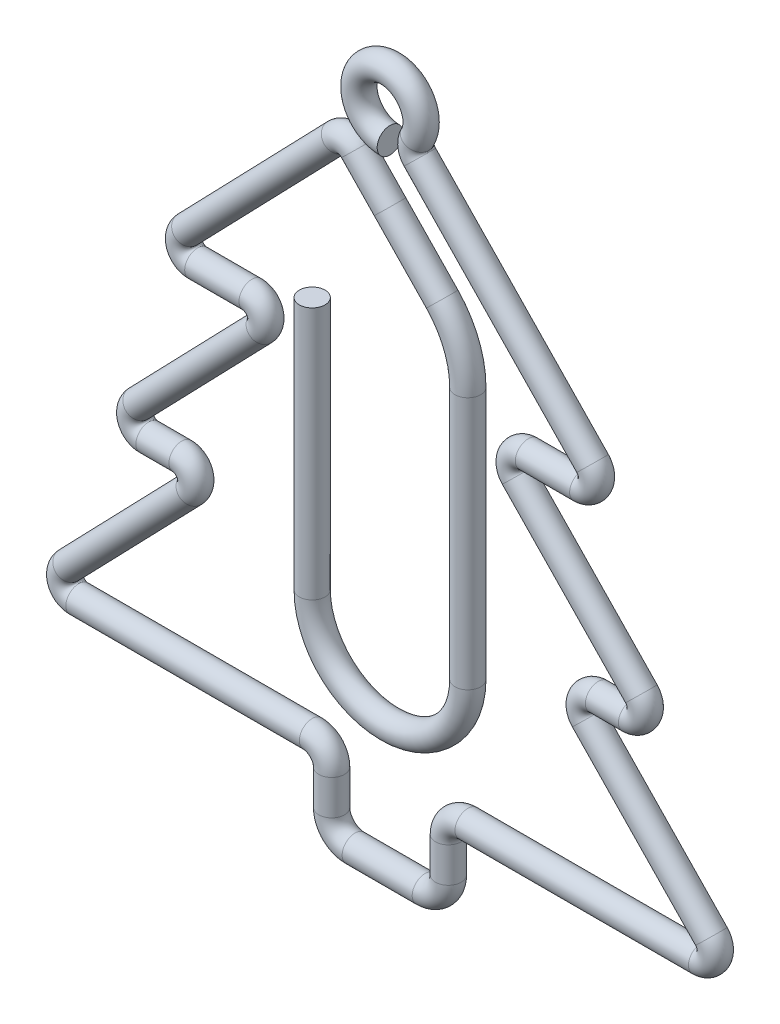
ISO-10303-21;
HEADER;
FILE_DESCRIPTION(('STEP AP214'),'2;1');
FILE_NAME('part.step','',(''),(''),'','','');
FILE_SCHEMA(('AUTOMOTIVE_DESIGN { 1 0 10303 214 1 1 1 1 }'));
ENDSEC;
DATA;
#1=APPLICATION_CONTEXT('core data for automotive mechanical design processes');
#2=APPLICATION_PROTOCOL_DEFINITION('international standard','automotive_design',2000,#1);
#3=PRODUCT_CONTEXT('',#1,'mechanical');
#4=PRODUCT('Part','Part','',(#3));
#5=PRODUCT_RELATED_PRODUCT_CATEGORY('part','',(#4));
#6=PRODUCT_DEFINITION_FORMATION('','',#4);
#7=PRODUCT_DEFINITION_CONTEXT('part definition',#1,'design');
#8=PRODUCT_DEFINITION('design','',#6,#7);
#9=PRODUCT_DEFINITION_SHAPE('','',#8);
#10=(LENGTH_UNIT() NAMED_UNIT(*) SI_UNIT(.MILLI.,.METRE.));
#11=(NAMED_UNIT(*) PLANE_ANGLE_UNIT() SI_UNIT($,.RADIAN.));
#12=(NAMED_UNIT(*) SI_UNIT($,.STERADIAN.) SOLID_ANGLE_UNIT());
#13=UNCERTAINTY_MEASURE_WITH_UNIT(LENGTH_MEASURE(1.E-05),#10,'distance_accuracy_value','');
#14=(GEOMETRIC_REPRESENTATION_CONTEXT(3) GLOBAL_UNCERTAINTY_ASSIGNED_CONTEXT((#13)) GLOBAL_UNIT_ASSIGNED_CONTEXT((#10,
#11,#12)) REPRESENTATION_CONTEXT('',''));
#15=CARTESIAN_POINT('',(0.,0.,0.));
#16=DIRECTION('',(0.,0.,1.));
#17=DIRECTION('',(1.,0.,0.));
#18=AXIS2_PLACEMENT_3D('',#15,#16,#17);
#19=CARTESIAN_POINT('',(0.,-8.,0.));
#20=DIRECTION('',(-1.,0.,0.));
#21=DIRECTION('',(0.,-1.,0.));
#22=AXIS2_PLACEMENT_3D('',#19,#20,#21);
#23=PLANE('',#22);
#24=CARTESIAN_POINT('',(0.,-8.,0.));
#25=DIRECTION('',(-1.,0.,0.));
#26=DIRECTION('',(0.,-1.,0.));
#27=AXIS2_PLACEMENT_3D('',#24,#25,#26);
#28=CIRCLE('',#27,3.3);
#29=CARTESIAN_POINT('',(0.,-11.3,0.));
#30=VERTEX_POINT('',#29);
#31=EDGE_CURVE('E153',#30,#30,#28,.T.);
#32=ORIENTED_EDGE('',*,*,#31,.F.);
#33=EDGE_LOOP('',(#32));
#34=FACE_BOUND('',#33,.T.);
#35=ADVANCED_FACE('F32',(#34),#23,.F.);
#36=CARTESIAN_POINT('',(-20.,-53.,0.));
#37=DIRECTION('',(0.,1.,0.));
#38=DIRECTION('',(-1.,0.,0.));
#39=AXIS2_PLACEMENT_3D('',#36,#37,#38);
#40=PLANE('',#39);
#41=CARTESIAN_POINT('',(-20.,-53.,0.));
#42=DIRECTION('',(0.,1.,0.));
#43=DIRECTION('',(-1.,0.,0.));
#44=AXIS2_PLACEMENT_3D('',#41,#42,#43);
#45=CIRCLE('',#44,3.3);
#46=CARTESIAN_POINT('',(-23.3,-53.,0.));
#47=VERTEX_POINT('',#46);
#48=EDGE_CURVE('E10',#47,#47,#45,.T.);
#49=ORIENTED_EDGE('',*,*,#48,.T.);
#50=EDGE_LOOP('',(#49));
#51=FACE_BOUND('',#50,.T.);
#52=ADVANCED_FACE('F160',(#51),#40,.T.);
#53=CARTESIAN_POINT('',(0.,0.,0.));
#54=DIRECTION('',(0.,0.,-1.));
#55=DIRECTION('',(-1.,0.,0.));
#56=AXIS2_PLACEMENT_3D('',#53,#54,#55);
#57=TOROIDAL_SURFACE('',#56,8.,3.3);
#58=CARTESIAN_POINT('',(7.06881872881562,-3.74590466765313,0.));
#59=DIRECTION('',(-0.468238083456642,-0.883602341101952,0.));
#60=DIRECTION('',(0.883602341101952,-0.468238083456642,0.));
#61=AXIS2_PLACEMENT_3D('',#58,#59,#60);
#62=CIRCLE('',#61,3.3);
#63=CARTESIAN_POINT('',(9.98470645445206,-5.29109034306005,0.));
#64=VERTEX_POINT('',#63);
#65=EDGE_CURVE('E150',#64,#64,#62,.T.);
#66=CARTESIAN_POINT('',(0.,0.,0.));
#67=DIRECTION('',(0.,0.,-1.));
#68=DIRECTION('',(-1.,0.,0.));
#69=AXIS2_PLACEMENT_3D('',#66,#67,#68);
#70=CIRCLE('',#69,11.3);
#71=EDGE_CURVE('',#30,#64,#70,.T.);
#72=ORIENTED_EDGE('',*,*,#31,.T.);
#73=ORIENTED_EDGE('',*,*,#65,.F.);
#74=ORIENTED_EDGE('',*,*,#71,.T.);
#75=ORIENTED_EDGE('',*,*,#71,.F.);
#76=EDGE_LOOP('',(#72,#74,#73,#75));
#77=FACE_BOUND('',#76,.T.);
#78=ADVANCED_FACE('F157',(#77),#57,.T.);
#79=CARTESIAN_POINT('',(10.2497871567827,-5.43156176809704,0.));
#80=DIRECTION('',(0.,0.,1.));
#81=DIRECTION('',(1.,0.,0.));
#82=AXIS2_PLACEMENT_3D('',#79,#80,#81);
#83=TOROIDAL_SURFACE('',#82,3.6,3.3);
#84=CARTESIAN_POINT('',(7.66016387556351,-7.93233190174944,0.));
#85=DIRECTION('',(0.694658370458998,-0.71933980033865,0.));
#86=DIRECTION('',(0.71933980033865,0.694658370458998,0.));
#87=AXIS2_PLACEMENT_3D('',#84,#85,#86);
#88=CIRCLE('',#87,3.3);
#89=CARTESIAN_POINT('',(10.0339852166811,-5.63995927923474,0.));
#90=VERTEX_POINT('',#89);
#91=EDGE_CURVE('E147',#90,#90,#88,.T.);
#92=ORIENTED_EDGE('',*,*,#91,.F.);
#93=EDGE_LOOP('',(#92));
#94=FACE_BOUND('',#93,.T.);
#95=ORIENTED_EDGE('',*,*,#65,.T.);
#96=EDGE_LOOP('',(#95));
#97=FACE_BOUND('',#96,.T.);
#98=ADVANCED_FACE('F310',(#94,#97),#83,.T.);
#99=CARTESIAN_POINT('',(7.66016387556351,-7.93233190174944,0.));
#100=DIRECTION('',(0.694658370458999,-0.71933980033865,0.));
#101=DIRECTION('',(0.71933980033865,0.694658370458999,0.));
#102=AXIS2_PLACEMENT_3D('',#99,#100,#101);
#103=CYLINDRICAL_SURFACE('',#102,3.3);
#104=CARTESIAN_POINT('',(52.0498812526783,-53.8992298663476,0.));
#105=DIRECTION('',(0.694658370458998,-0.71933980033865,0.));
#106=DIRECTION('',(0.71933980033865,0.694658370458998,0.));
#107=AXIS2_PLACEMENT_3D('',#104,#105,#106);
#108=CIRCLE('',#107,3.3);
#109=CARTESIAN_POINT('',(54.4237025937958,-51.6068572438329,0.));
#110=VERTEX_POINT('',#109);
#111=EDGE_CURVE('E144',#110,#110,#108,.T.);
#112=ORIENTED_EDGE('',*,*,#111,.F.);
#113=EDGE_LOOP('',(#112));
#114=FACE_BOUND('',#113,.T.);
#115=ORIENTED_EDGE('',*,*,#91,.T.);
#116=EDGE_LOOP('',(#115));
#117=FACE_BOUND('',#116,.T.);
#118=ADVANCED_FACE('F306',(#114,#117),#103,.T.);
#119=CARTESIAN_POINT('',(49.4602579714592,-56.4,0.));
#120=DIRECTION('',(0.,0.,-1.));
#121=DIRECTION('',(-1.,0.,0.));
#122=AXIS2_PLACEMENT_3D('',#119,#120,#121);
#123=TOROIDAL_SURFACE('',#122,3.6,3.3);
#124=CARTESIAN_POINT('',(49.4602579714592,-60.,0.));
#125=DIRECTION('',(-1.,0.,0.));
#126=DIRECTION('',(0.,-1.,0.));
#127=AXIS2_PLACEMENT_3D('',#124,#125,#126);
#128=CIRCLE('',#127,3.3);
#129=CARTESIAN_POINT('',(49.4602579714592,-63.3,0.));
#130=VERTEX_POINT('',#129);
#131=EDGE_CURVE('E141',#130,#130,#128,.T.);
#132=CARTESIAN_POINT('',(49.4602579714592,-56.4,0.));
#133=DIRECTION('',(0.,0.,-1.));
#134=DIRECTION('',(-1.,0.,0.));
#135=AXIS2_PLACEMENT_3D('',#132,#133,#134);
#136=CIRCLE('',#135,6.9);
#137=EDGE_CURVE('',#110,#130,#136,.T.);
#138=ORIENTED_EDGE('',*,*,#111,.T.);
#139=ORIENTED_EDGE('',*,*,#131,.F.);
#140=ORIENTED_EDGE('',*,*,#137,.T.);
#141=ORIENTED_EDGE('',*,*,#137,.F.);
#142=EDGE_LOOP('',(#138,#140,#139,#141));
#143=FACE_BOUND('',#142,.T.);
#144=ADVANCED_FACE('F302',(#143),#123,.T.);
#145=CARTESIAN_POINT('',(49.4602579714592,-60.,0.));
#146=DIRECTION('',(-1.,0.,0.));
#147=DIRECTION('',(0.,0.,1.));
#148=AXIS2_PLACEMENT_3D('',#145,#146,#147);
#149=CYLINDRICAL_SURFACE('',#148,3.3);
#150=CARTESIAN_POINT('',(35.5061421676126,-60.,0.));
#151=DIRECTION('',(-1.,0.,0.));
#152=DIRECTION('',(0.,-1.,0.));
#153=AXIS2_PLACEMENT_3D('',#150,#151,#152);
#154=CIRCLE('',#153,3.3);
#155=CARTESIAN_POINT('',(35.5061421676126,-56.7,0.));
#156=VERTEX_POINT('',#155);
#157=EDGE_CURVE('E138',#156,#156,#154,.T.);
#158=ORIENTED_EDGE('',*,*,#157,.F.);
#159=EDGE_LOOP('',(#158));
#160=FACE_BOUND('',#159,.T.);
#161=ORIENTED_EDGE('',*,*,#131,.T.);
#162=EDGE_LOOP('',(#161));
#163=FACE_BOUND('',#162,.T.);
#164=ADVANCED_FACE('F298',(#160,#163),#149,.T.);
#165=CARTESIAN_POINT('',(35.5061421676126,-63.6,0.));
#166=DIRECTION('',(0.,0.,1.));
#167=DIRECTION('',(1.,0.,0.));
#168=AXIS2_PLACEMENT_3D('',#165,#166,#167);
#169=TOROIDAL_SURFACE('',#168,3.59999999999999,3.3);
#170=CARTESIAN_POINT('',(32.9165188863934,-66.1007701336524,0.));
#171=DIRECTION('',(0.694658370458998,-0.71933980033865,0.));
#172=DIRECTION('',(0.71933980033865,0.694658370458998,0.));
#173=AXIS2_PLACEMENT_3D('',#170,#171,#172);
#174=CIRCLE('',#173,3.3);
#175=CARTESIAN_POINT('',(30.5426975452759,-68.3931427561671,0.));
#176=VERTEX_POINT('',#175);
#177=EDGE_CURVE('E135',#176,#176,#174,.T.);
#178=CARTESIAN_POINT('',(35.5061421676126,-63.6,0.));
#179=DIRECTION('',(0.,0.,1.));
#180=DIRECTION('',(1.,0.,0.));
#181=AXIS2_PLACEMENT_3D('',#178,#179,#180);
#182=CIRCLE('',#181,6.89999999999999);
#183=EDGE_CURVE('',#156,#176,#182,.T.);
#184=ORIENTED_EDGE('',*,*,#157,.T.);
#185=ORIENTED_EDGE('',*,*,#177,.F.);
#186=ORIENTED_EDGE('',*,*,#183,.T.);
#187=ORIENTED_EDGE('',*,*,#183,.F.);
#188=EDGE_LOOP('',(#184,#186,#185,#187));
#189=FACE_BOUND('',#188,.T.);
#190=ADVANCED_FACE('F294',(#189),#169,.T.);
#191=CARTESIAN_POINT('',(32.9165188863934,-66.1007701336524,0.));
#192=DIRECTION('',(0.694658370458998,-0.71933980033865,0.));
#193=DIRECTION('',(0.71933980033865,0.694658370458998,0.));
#194=AXIS2_PLACEMENT_3D('',#191,#192,#193);
#195=CYLINDRICAL_SURFACE('',#194,3.3);
#196=CARTESIAN_POINT('',(64.5896232812191,-98.8992298663476,0.));
#197=DIRECTION('',(0.694658370458998,-0.719339800338651,0.));
#198=DIRECTION('',(0.719339800338651,0.694658370458998,0.));
#199=AXIS2_PLACEMENT_3D('',#196,#197,#198);
#200=CIRCLE('',#199,3.3);
#201=CARTESIAN_POINT('',(66.9634446223367,-96.6068572438329,0.));
#202=VERTEX_POINT('',#201);
#203=EDGE_CURVE('E132',#202,#202,#200,.T.);
#204=ORIENTED_EDGE('',*,*,#203,.F.);
#205=EDGE_LOOP('',(#204));
#206=FACE_BOUND('',#205,.T.);
#207=ORIENTED_EDGE('',*,*,#177,.T.);
#208=EDGE_LOOP('',(#207));
#209=FACE_BOUND('',#208,.T.);
#210=ADVANCED_FACE('F290',(#206,#209),#195,.T.);
#211=CARTESIAN_POINT('',(62.,-101.4,0.));
#212=DIRECTION('',(0.,0.,-1.));
#213=DIRECTION('',(-1.,0.,0.));
#214=AXIS2_PLACEMENT_3D('',#211,#212,#213);
#215=TOROIDAL_SURFACE('',#214,3.6,3.3);
#216=CARTESIAN_POINT('',(62.,-105.,0.));
#217=DIRECTION('',(-1.,0.,0.));
#218=DIRECTION('',(0.,-1.,0.));
#219=AXIS2_PLACEMENT_3D('',#216,#217,#218);
#220=CIRCLE('',#219,3.3);
#221=CARTESIAN_POINT('',(62.,-108.3,0.));
#222=VERTEX_POINT('',#221);
#223=EDGE_CURVE('E129',#222,#222,#220,.T.);
#224=CARTESIAN_POINT('',(62.,-101.4,0.));
#225=DIRECTION('',(0.,0.,-1.));
#226=DIRECTION('',(-1.,0.,0.));
#227=AXIS2_PLACEMENT_3D('',#224,#225,#226);
#228=CIRCLE('',#227,6.9);
#229=EDGE_CURVE('',#202,#222,#228,.T.);
#230=ORIENTED_EDGE('',*,*,#203,.T.);
#231=ORIENTED_EDGE('',*,*,#223,.F.);
#232=ORIENTED_EDGE('',*,*,#229,.T.);
#233=ORIENTED_EDGE('',*,*,#229,.F.);
#234=EDGE_LOOP('',(#230,#232,#231,#233));
#235=FACE_BOUND('',#234,.T.);
#236=ADVANCED_FACE('F286',(#235),#215,.T.);
#237=CARTESIAN_POINT('',(62.,-105.,0.));
#238=DIRECTION('',(-1.,0.,0.));
#239=DIRECTION('',(0.,-1.,0.));
#240=AXIS2_PLACEMENT_3D('',#237,#238,#239);
#241=CYLINDRICAL_SURFACE('',#240,3.3);
#242=CARTESIAN_POINT('',(53.5061421676126,-105.,0.));
#243=DIRECTION('',(-1.,0.,0.));
#244=DIRECTION('',(0.,-1.,0.));
#245=AXIS2_PLACEMENT_3D('',#242,#243,#244);
#246=CIRCLE('',#245,3.3);
#247=CARTESIAN_POINT('',(53.5061421676126,-101.7,0.));
#248=VERTEX_POINT('',#247);
#249=EDGE_CURVE('E126',#248,#248,#246,.T.);
#250=ORIENTED_EDGE('',*,*,#249,.F.);
#251=EDGE_LOOP('',(#250));
#252=FACE_BOUND('',#251,.T.);
#253=ORIENTED_EDGE('',*,*,#223,.T.);
#254=EDGE_LOOP('',(#253));
#255=FACE_BOUND('',#254,.T.);
#256=ADVANCED_FACE('F282',(#252,#255),#241,.T.);
#257=CARTESIAN_POINT('',(53.5061421676126,-108.6,0.));
#258=DIRECTION('',(0.,0.,1.));
#259=DIRECTION('',(1.,0.,0.));
#260=AXIS2_PLACEMENT_3D('',#257,#258,#259);
#261=TOROIDAL_SURFACE('',#260,3.59999999999998,3.3);
#262=CARTESIAN_POINT('',(50.9165188863935,-111.100770133652,0.));
#263=DIRECTION('',(0.694658370459002,-0.719339800338647,0.));
#264=DIRECTION('',(0.719339800338647,0.694658370459002,0.));
#265=AXIS2_PLACEMENT_3D('',#262,#263,#264);
#266=CIRCLE('',#265,3.3);
#267=CARTESIAN_POINT('',(48.5426975452759,-113.393142756167,0.));
#268=VERTEX_POINT('',#267);
#269=EDGE_CURVE('E123',#268,#268,#266,.T.);
#270=CARTESIAN_POINT('',(53.5061421676126,-108.6,0.));
#271=DIRECTION('',(0.,0.,1.));
#272=DIRECTION('',(1.,0.,0.));
#273=AXIS2_PLACEMENT_3D('',#270,#271,#272);
#274=CIRCLE('',#273,6.89999999999998);
#275=EDGE_CURVE('',#248,#268,#274,.T.);
#276=ORIENTED_EDGE('',*,*,#249,.T.);
#277=ORIENTED_EDGE('',*,*,#269,.F.);
#278=ORIENTED_EDGE('',*,*,#275,.T.);
#279=ORIENTED_EDGE('',*,*,#275,.F.);
#280=EDGE_LOOP('',(#276,#278,#277,#279));
#281=FACE_BOUND('',#280,.T.);
#282=ADVANCED_FACE('F278',(#281),#261,.T.);
#283=CARTESIAN_POINT('',(50.9165188863935,-111.100770133652,0.));
#284=DIRECTION('',(0.694658370458999,-0.719339800338649,0.));
#285=DIRECTION('',(0.719339800338649,0.694658370458999,0.));
#286=AXIS2_PLACEMENT_3D('',#283,#284,#285);
#287=CYLINDRICAL_SURFACE('',#286,3.3);
#288=CARTESIAN_POINT('',(82.5896232812192,-143.899229866348,0.));
#289=DIRECTION('',(0.694658370458999,-0.71933980033865,0.));
#290=DIRECTION('',(0.71933980033865,0.694658370458999,0.));
#291=AXIS2_PLACEMENT_3D('',#288,#289,#290);
#292=CIRCLE('',#291,3.3);
#293=CARTESIAN_POINT('',(84.9634446223368,-141.606857243833,0.));
#294=VERTEX_POINT('',#293);
#295=EDGE_CURVE('E120',#294,#294,#292,.T.);
#296=ORIENTED_EDGE('',*,*,#295,.F.);
#297=EDGE_LOOP('',(#296));
#298=FACE_BOUND('',#297,.T.);
#299=ORIENTED_EDGE('',*,*,#269,.T.);
#300=EDGE_LOOP('',(#299));
#301=FACE_BOUND('',#300,.T.);
#302=ADVANCED_FACE('F274',(#298,#301),#287,.T.);
#303=CARTESIAN_POINT('',(80.,-146.4,0.));
#304=DIRECTION('',(0.,0.,-1.));
#305=DIRECTION('',(-1.,0.,0.));
#306=AXIS2_PLACEMENT_3D('',#303,#304,#305);
#307=TOROIDAL_SURFACE('',#306,3.60000000000003,3.3);
#308=CARTESIAN_POINT('',(80.,-150.,0.));
#309=DIRECTION('',(-1.,0.,0.));
#310=DIRECTION('',(0.,-1.,0.));
#311=AXIS2_PLACEMENT_3D('',#308,#309,#310);
#312=CIRCLE('',#311,3.3);
#313=CARTESIAN_POINT('',(80.,-153.3,0.));
#314=VERTEX_POINT('',#313);
#315=EDGE_CURVE('E117',#314,#314,#312,.T.);
#316=CARTESIAN_POINT('',(80.,-146.4,0.));
#317=DIRECTION('',(0.,0.,-1.));
#318=DIRECTION('',(-1.,0.,0.));
#319=AXIS2_PLACEMENT_3D('',#316,#317,#318);
#320=CIRCLE('',#319,6.90000000000003);
#321=EDGE_CURVE('',#294,#314,#320,.T.);
#322=ORIENTED_EDGE('',*,*,#295,.T.);
#323=ORIENTED_EDGE('',*,*,#315,.F.);
#324=ORIENTED_EDGE('',*,*,#321,.T.);
#325=ORIENTED_EDGE('',*,*,#321,.F.);
#326=EDGE_LOOP('',(#322,#324,#323,#325));
#327=FACE_BOUND('',#326,.T.);
#328=ADVANCED_FACE('F270',(#327),#307,.T.);
#329=CARTESIAN_POINT('',(80.,-150.,0.));
#330=DIRECTION('',(-1.,0.,0.));
#331=DIRECTION('',(0.,0.,1.));
#332=AXIS2_PLACEMENT_3D('',#329,#330,#331);
#333=CYLINDRICAL_SURFACE('',#332,3.3);
#334=CARTESIAN_POINT('',(20.,-150.,0.));
#335=DIRECTION('',(-1.,0.,0.));
#336=DIRECTION('',(0.,-1.,0.));
#337=AXIS2_PLACEMENT_3D('',#334,#335,#336);
#338=CIRCLE('',#337,3.3);
#339=CARTESIAN_POINT('',(20.,-146.7,0.));
#340=VERTEX_POINT('',#339);
#341=EDGE_CURVE('E114',#340,#340,#338,.T.);
#342=ORIENTED_EDGE('',*,*,#341,.F.);
#343=EDGE_LOOP('',(#342));
#344=FACE_BOUND('',#343,.T.);
#345=ORIENTED_EDGE('',*,*,#315,.T.);
#346=EDGE_LOOP('',(#345));
#347=FACE_BOUND('',#346,.T.);
#348=ADVANCED_FACE('F266',(#344,#347),#333,.T.);
#349=CARTESIAN_POINT('',(20.,-155.,0.));
#350=DIRECTION('',(0.,0.,1.));
#351=DIRECTION('',(1.,0.,0.));
#352=AXIS2_PLACEMENT_3D('',#349,#350,#351);
#353=TOROIDAL_SURFACE('',#352,5.,3.3);
#354=CARTESIAN_POINT('',(15.,-155.,0.));
#355=DIRECTION('',(0.,-1.,0.));
#356=DIRECTION('',(1.,0.,0.));
#357=AXIS2_PLACEMENT_3D('',#354,#355,#356);
#358=CIRCLE('',#357,3.3);
#359=CARTESIAN_POINT('',(11.7,-155.,0.));
#360=VERTEX_POINT('',#359);
#361=EDGE_CURVE('E111',#360,#360,#358,.T.);
#362=CARTESIAN_POINT('',(20.,-155.,0.));
#363=DIRECTION('',(0.,0.,1.));
#364=DIRECTION('',(1.,0.,0.));
#365=AXIS2_PLACEMENT_3D('',#362,#363,#364);
#366=CIRCLE('',#365,8.30000000000001);
#367=EDGE_CURVE('',#340,#360,#366,.T.);
#368=ORIENTED_EDGE('',*,*,#341,.T.);
#369=ORIENTED_EDGE('',*,*,#361,.F.);
#370=ORIENTED_EDGE('',*,*,#367,.T.);
#371=ORIENTED_EDGE('',*,*,#367,.F.);
#372=EDGE_LOOP('',(#368,#370,#369,#371));
#373=FACE_BOUND('',#372,.T.);
#374=ADVANCED_FACE('F262',(#373),#353,.T.);
#375=CARTESIAN_POINT('',(15.,-155.,0.));
#376=DIRECTION('',(0.,-1.,0.));
#377=DIRECTION('',(1.,0.,0.));
#378=AXIS2_PLACEMENT_3D('',#375,#376,#377);
#379=CYLINDRICAL_SURFACE('',#378,3.3);
#380=CARTESIAN_POINT('',(15.,-164.,0.));
#381=DIRECTION('',(0.,-1.,0.));
#382=DIRECTION('',(1.,0.,0.));
#383=AXIS2_PLACEMENT_3D('',#380,#381,#382);
#384=CIRCLE('',#383,3.3);
#385=CARTESIAN_POINT('',(18.3,-164.,0.));
#386=VERTEX_POINT('',#385);
#387=EDGE_CURVE('E108',#386,#386,#384,.T.);
#388=ORIENTED_EDGE('',*,*,#387,.F.);
#389=EDGE_LOOP('',(#388));
#390=FACE_BOUND('',#389,.T.);
#391=ORIENTED_EDGE('',*,*,#361,.T.);
#392=EDGE_LOOP('',(#391));
#393=FACE_BOUND('',#392,.T.);
#394=ADVANCED_FACE('F258',(#390,#393),#379,.T.);
#395=CARTESIAN_POINT('',(9.,-164.,0.));
#396=DIRECTION('',(0.,0.,-1.));
#397=DIRECTION('',(-1.,0.,0.));
#398=AXIS2_PLACEMENT_3D('',#395,#396,#397);
#399=TOROIDAL_SURFACE('',#398,6.00000000000002,3.3);
#400=CARTESIAN_POINT('',(9.00000000000001,-170.,0.));
#401=DIRECTION('',(-1.,0.,0.));
#402=DIRECTION('',(0.,-1.,0.));
#403=AXIS2_PLACEMENT_3D('',#400,#401,#402);
#404=CIRCLE('',#403,3.3);
#405=CARTESIAN_POINT('',(9.00000000000001,-173.3,0.));
#406=VERTEX_POINT('',#405);
#407=EDGE_CURVE('E105',#406,#406,#404,.T.);
#408=CARTESIAN_POINT('',(9.,-164.,0.));
#409=DIRECTION('',(0.,0.,-1.));
#410=DIRECTION('',(-1.,0.,0.));
#411=AXIS2_PLACEMENT_3D('',#408,#409,#410);
#412=CIRCLE('',#411,9.30000000000002);
#413=EDGE_CURVE('',#386,#406,#412,.T.);
#414=ORIENTED_EDGE('',*,*,#387,.T.);
#415=ORIENTED_EDGE('',*,*,#407,.F.);
#416=ORIENTED_EDGE('',*,*,#413,.T.);
#417=ORIENTED_EDGE('',*,*,#413,.F.);
#418=EDGE_LOOP('',(#414,#416,#415,#417));
#419=FACE_BOUND('',#418,.T.);
#420=ADVANCED_FACE('F254',(#419),#399,.T.);
#421=CARTESIAN_POINT('',(9.00000000000001,-170.,0.));
#422=DIRECTION('',(-1.,0.,0.));
#423=DIRECTION('',(0.,0.,1.));
#424=AXIS2_PLACEMENT_3D('',#421,#422,#423);
#425=CYLINDRICAL_SURFACE('',#424,3.3);
#426=CARTESIAN_POINT('',(-9.,-170.,0.));
#427=DIRECTION('',(-1.,0.,0.));
#428=DIRECTION('',(0.,-1.,0.));
#429=AXIS2_PLACEMENT_3D('',#426,#427,#428);
#430=CIRCLE('',#429,3.3);
#431=CARTESIAN_POINT('',(-8.99999999999999,-173.3,0.));
#432=VERTEX_POINT('',#431);
#433=EDGE_CURVE('E102',#432,#432,#430,.T.);
#434=ORIENTED_EDGE('',*,*,#433,.F.);
#435=EDGE_LOOP('',(#434));
#436=FACE_BOUND('',#435,.T.);
#437=ORIENTED_EDGE('',*,*,#407,.T.);
#438=EDGE_LOOP('',(#437));
#439=FACE_BOUND('',#438,.T.);
#440=ADVANCED_FACE('F250',(#436,#439),#425,.T.);
#441=CARTESIAN_POINT('',(-9.,-164.,0.));
#442=DIRECTION('',(0.,0.,-1.));
#443=DIRECTION('',(-1.,0.,0.));
#444=AXIS2_PLACEMENT_3D('',#441,#442,#443);
#445=TOROIDAL_SURFACE('',#444,6.00000000000001,3.3);
#446=CARTESIAN_POINT('',(-15.,-164.,0.));
#447=DIRECTION('',(0.,1.,0.));
#448=DIRECTION('',(-1.,0.,0.));
#449=AXIS2_PLACEMENT_3D('',#446,#447,#448);
#450=CIRCLE('',#449,3.3);
#451=CARTESIAN_POINT('',(-18.3,-164.,0.));
#452=VERTEX_POINT('',#451);
#453=EDGE_CURVE('E99',#452,#452,#450,.T.);
#454=CARTESIAN_POINT('',(-9.,-164.,0.));
#455=DIRECTION('',(0.,0.,-1.));
#456=DIRECTION('',(-1.,0.,0.));
#457=AXIS2_PLACEMENT_3D('',#454,#455,#456);
#458=CIRCLE('',#457,9.30000000000001);
#459=EDGE_CURVE('',#432,#452,#458,.T.);
#460=ORIENTED_EDGE('',*,*,#433,.T.);
#461=ORIENTED_EDGE('',*,*,#453,.F.);
#462=ORIENTED_EDGE('',*,*,#459,.T.);
#463=ORIENTED_EDGE('',*,*,#459,.F.);
#464=EDGE_LOOP('',(#460,#462,#461,#463));
#465=FACE_BOUND('',#464,.T.);
#466=ADVANCED_FACE('F246',(#465),#445,.T.);
#467=CARTESIAN_POINT('',(-15.,-164.,0.));
#468=DIRECTION('',(0.,1.,0.));
#469=DIRECTION('',(-1.,0.,0.));
#470=AXIS2_PLACEMENT_3D('',#467,#468,#469);
#471=CYLINDRICAL_SURFACE('',#470,3.3);
#472=CARTESIAN_POINT('',(-15.,-155.,0.));
#473=DIRECTION('',(0.,1.,0.));
#474=DIRECTION('',(-1.,0.,0.));
#475=AXIS2_PLACEMENT_3D('',#472,#473,#474);
#476=CIRCLE('',#475,3.3);
#477=CARTESIAN_POINT('',(-11.7,-155.,0.));
#478=VERTEX_POINT('',#477);
#479=EDGE_CURVE('E96',#478,#478,#476,.T.);
#480=ORIENTED_EDGE('',*,*,#479,.F.);
#481=EDGE_LOOP('',(#480));
#482=FACE_BOUND('',#481,.T.);
#483=ORIENTED_EDGE('',*,*,#453,.T.);
#484=EDGE_LOOP('',(#483));
#485=FACE_BOUND('',#484,.T.);
#486=ADVANCED_FACE('F242',(#482,#485),#471,.T.);
#487=CARTESIAN_POINT('',(-20.,-155.,0.));
#488=DIRECTION('',(0.,0.,1.));
#489=DIRECTION('',(1.,0.,0.));
#490=AXIS2_PLACEMENT_3D('',#487,#488,#489);
#491=TOROIDAL_SURFACE('',#490,5.,3.3);
#492=CARTESIAN_POINT('',(-20.,-150.,0.));
#493=DIRECTION('',(-1.,0.,0.));
#494=DIRECTION('',(0.,-1.,0.));
#495=AXIS2_PLACEMENT_3D('',#492,#493,#494);
#496=CIRCLE('',#495,3.3);
#497=CARTESIAN_POINT('',(-20.,-146.7,0.));
#498=VERTEX_POINT('',#497);
#499=EDGE_CURVE('E93',#498,#498,#496,.T.);
#500=CARTESIAN_POINT('',(-20.,-155.,0.));
#501=DIRECTION('',(0.,0.,1.));
#502=DIRECTION('',(1.,0.,0.));
#503=AXIS2_PLACEMENT_3D('',#500,#501,#502);
#504=CIRCLE('',#503,8.3);
#505=EDGE_CURVE('',#478,#498,#504,.T.);
#506=ORIENTED_EDGE('',*,*,#479,.T.);
#507=ORIENTED_EDGE('',*,*,#499,.F.);
#508=ORIENTED_EDGE('',*,*,#505,.T.);
#509=ORIENTED_EDGE('',*,*,#505,.F.);
#510=EDGE_LOOP('',(#506,#508,#507,#509));
#511=FACE_BOUND('',#510,.T.);
#512=ADVANCED_FACE('F238',(#511),#491,.T.);
#513=CARTESIAN_POINT('',(-20.,-150.,0.));
#514=DIRECTION('',(-1.,0.,0.));
#515=DIRECTION('',(0.,0.,1.));
#516=AXIS2_PLACEMENT_3D('',#513,#514,#515);
#517=CYLINDRICAL_SURFACE('',#516,3.3);
#518=CARTESIAN_POINT('',(-80.,-150.,0.));
#519=DIRECTION('',(-1.,0.,0.));
#520=DIRECTION('',(0.,-1.,0.));
#521=AXIS2_PLACEMENT_3D('',#518,#519,#520);
#522=CIRCLE('',#521,3.3);
#523=CARTESIAN_POINT('',(-80.,-153.3,0.));
#524=VERTEX_POINT('',#523);
#525=EDGE_CURVE('E90',#524,#524,#522,.T.);
#526=ORIENTED_EDGE('',*,*,#525,.F.);
#527=EDGE_LOOP('',(#526));
#528=FACE_BOUND('',#527,.T.);
#529=ORIENTED_EDGE('',*,*,#499,.T.);
#530=EDGE_LOOP('',(#529));
#531=FACE_BOUND('',#530,.T.);
#532=ADVANCED_FACE('F234',(#528,#531),#517,.T.);
#533=CARTESIAN_POINT('',(-80.,-146.4,0.));
#534=DIRECTION('',(0.,0.,-1.));
#535=DIRECTION('',(-1.,0.,0.));
#536=AXIS2_PLACEMENT_3D('',#533,#534,#535);
#537=TOROIDAL_SURFACE('',#536,3.59999999999999,3.3);
#538=CARTESIAN_POINT('',(-82.5896232812192,-143.899229866348,0.));
#539=DIRECTION('',(0.69465837045899,0.719339800338658,0.));
#540=DIRECTION('',(-0.719339800338658,0.694658370458991,0.));
#541=AXIS2_PLACEMENT_3D('',#538,#539,#540);
#542=CIRCLE('',#541,3.3);
#543=CARTESIAN_POINT('',(-84.9634446223367,-141.606857243833,0.));
#544=VERTEX_POINT('',#543);
#545=EDGE_CURVE('E87',#544,#544,#542,.T.);
#546=CARTESIAN_POINT('',(-80.,-146.4,0.));
#547=DIRECTION('',(0.,0.,-1.));
#548=DIRECTION('',(-1.,0.,0.));
#549=AXIS2_PLACEMENT_3D('',#546,#547,#548);
#550=CIRCLE('',#549,6.89999999999999);
#551=EDGE_CURVE('',#524,#544,#550,.T.);
#552=ORIENTED_EDGE('',*,*,#525,.T.);
#553=ORIENTED_EDGE('',*,*,#545,.F.);
#554=ORIENTED_EDGE('',*,*,#551,.T.);
#555=ORIENTED_EDGE('',*,*,#551,.F.);
#556=EDGE_LOOP('',(#552,#554,#553,#555));
#557=FACE_BOUND('',#556,.T.);
#558=ADVANCED_FACE('F230',(#557),#537,.T.);
#559=CARTESIAN_POINT('',(-82.5896232812191,-143.899229866348,0.));
#560=DIRECTION('',(0.694658370458999,0.719339800338649,0.));
#561=DIRECTION('',(-0.71933980033865,0.694658370458999,0.));
#562=AXIS2_PLACEMENT_3D('',#559,#560,#561);
#563=CYLINDRICAL_SURFACE('',#562,3.3);
#564=CARTESIAN_POINT('',(-50.9165188863934,-111.100770133652,0.));
#565=DIRECTION('',(0.694658370459,0.719339800338649,0.));
#566=DIRECTION('',(-0.719339800338649,0.694658370459,0.));
#567=AXIS2_PLACEMENT_3D('',#564,#565,#566);
#568=CIRCLE('',#567,3.3);
#569=CARTESIAN_POINT('',(-48.5426975452759,-113.393142756167,0.));
#570=VERTEX_POINT('',#569);
#571=EDGE_CURVE('E84',#570,#570,#568,.T.);
#572=ORIENTED_EDGE('',*,*,#571,.F.);
#573=EDGE_LOOP('',(#572));
#574=FACE_BOUND('',#573,.T.);
#575=ORIENTED_EDGE('',*,*,#545,.T.);
#576=EDGE_LOOP('',(#575));
#577=FACE_BOUND('',#576,.T.);
#578=ADVANCED_FACE('F226',(#574,#577),#563,.T.);
#579=CARTESIAN_POINT('',(-53.5061421676126,-108.6,0.));
#580=DIRECTION('',(0.,0.,1.));
#581=DIRECTION('',(1.,0.,0.));
#582=AXIS2_PLACEMENT_3D('',#579,#580,#581);
#583=TOROIDAL_SURFACE('',#582,3.6,3.3);
#584=CARTESIAN_POINT('',(-53.5061421676126,-105.,0.));
#585=DIRECTION('',(-1.,0.,0.));
#586=DIRECTION('',(0.,-1.,0.));
#587=AXIS2_PLACEMENT_3D('',#584,#585,#586);
#588=CIRCLE('',#587,3.3);
#589=CARTESIAN_POINT('',(-53.5061421676126,-101.7,0.));
#590=VERTEX_POINT('',#589);
#591=EDGE_CURVE('E81',#590,#590,#588,.T.);
#592=CARTESIAN_POINT('',(-53.5061421676126,-108.6,0.));
#593=DIRECTION('',(0.,0.,1.));
#594=DIRECTION('',(1.,0.,0.));
#595=AXIS2_PLACEMENT_3D('',#592,#593,#594);
#596=CIRCLE('',#595,6.9);
#597=EDGE_CURVE('',#570,#590,#596,.T.);
#598=ORIENTED_EDGE('',*,*,#571,.T.);
#599=ORIENTED_EDGE('',*,*,#591,.F.);
#600=ORIENTED_EDGE('',*,*,#597,.T.);
#601=ORIENTED_EDGE('',*,*,#597,.F.);
#602=EDGE_LOOP('',(#598,#600,#599,#601));
#603=FACE_BOUND('',#602,.T.);
#604=ADVANCED_FACE('F222',(#603),#583,.T.);
#605=CARTESIAN_POINT('',(-53.5061421676125,-105.,0.));
#606=DIRECTION('',(-1.,0.,0.));
#607=DIRECTION('',(0.,-1.,0.));
#608=AXIS2_PLACEMENT_3D('',#605,#606,#607);
#609=CYLINDRICAL_SURFACE('',#608,3.3);
#610=CARTESIAN_POINT('',(-62.,-105.,0.));
#611=DIRECTION('',(-1.,0.,0.));
#612=DIRECTION('',(0.,-1.,0.));
#613=AXIS2_PLACEMENT_3D('',#610,#611,#612);
#614=CIRCLE('',#613,3.3);
#615=CARTESIAN_POINT('',(-61.9999999999999,-108.3,0.));
#616=VERTEX_POINT('',#615);
#617=EDGE_CURVE('E78',#616,#616,#614,.T.);
#618=ORIENTED_EDGE('',*,*,#617,.F.);
#619=EDGE_LOOP('',(#618));
#620=FACE_BOUND('',#619,.T.);
#621=ORIENTED_EDGE('',*,*,#591,.T.);
#622=EDGE_LOOP('',(#621));
#623=FACE_BOUND('',#622,.T.);
#624=ADVANCED_FACE('F218',(#620,#623),#609,.T.);
#625=CARTESIAN_POINT('',(-62.,-101.4,0.));
#626=DIRECTION('',(0.,0.,-1.));
#627=DIRECTION('',(-1.,0.,0.));
#628=AXIS2_PLACEMENT_3D('',#625,#626,#627);
#629=TOROIDAL_SURFACE('',#628,3.60000000000001,3.3);
#630=CARTESIAN_POINT('',(-64.5896232812191,-98.8992298663476,0.));
#631=DIRECTION('',(0.694658370459,0.719339800338648,0.));
#632=DIRECTION('',(-0.719339800338648,0.694658370459,0.));
#633=AXIS2_PLACEMENT_3D('',#630,#631,#632);
#634=CIRCLE('',#633,3.3);
#635=CARTESIAN_POINT('',(-66.9634446223367,-96.6068572438329,0.));
#636=VERTEX_POINT('',#635);
#637=EDGE_CURVE('E75',#636,#636,#634,.T.);
#638=CARTESIAN_POINT('',(-62.,-101.4,0.));
#639=DIRECTION('',(0.,0.,-1.));
#640=DIRECTION('',(-1.,0.,0.));
#641=AXIS2_PLACEMENT_3D('',#638,#639,#640);
#642=CIRCLE('',#641,6.90000000000001);
#643=EDGE_CURVE('',#616,#636,#642,.T.);
#644=ORIENTED_EDGE('',*,*,#617,.T.);
#645=ORIENTED_EDGE('',*,*,#637,.F.);
#646=ORIENTED_EDGE('',*,*,#643,.T.);
#647=ORIENTED_EDGE('',*,*,#643,.F.);
#648=EDGE_LOOP('',(#644,#646,#645,#647));
#649=FACE_BOUND('',#648,.T.);
#650=ADVANCED_FACE('F214',(#649),#629,.T.);
#651=CARTESIAN_POINT('',(-64.5896232812191,-98.8992298663476,0.));
#652=DIRECTION('',(0.694658370458998,0.71933980033865,0.));
#653=DIRECTION('',(-0.71933980033865,0.694658370458998,0.));
#654=AXIS2_PLACEMENT_3D('',#651,#652,#653);
#655=CYLINDRICAL_SURFACE('',#654,3.3);
#656=CARTESIAN_POINT('',(-32.9165188863934,-66.1007701336524,0.));
#657=DIRECTION('',(0.694658370458999,0.719339800338649,0.));
#658=DIRECTION('',(-0.719339800338649,0.694658370458999,0.));
#659=AXIS2_PLACEMENT_3D('',#656,#657,#658);
#660=CIRCLE('',#659,3.3);
#661=CARTESIAN_POINT('',(-30.5426975452758,-68.3931427561671,0.));
#662=VERTEX_POINT('',#661);
#663=EDGE_CURVE('E72',#662,#662,#660,.T.);
#664=ORIENTED_EDGE('',*,*,#663,.F.);
#665=EDGE_LOOP('',(#664));
#666=FACE_BOUND('',#665,.T.);
#667=ORIENTED_EDGE('',*,*,#637,.T.);
#668=EDGE_LOOP('',(#667));
#669=FACE_BOUND('',#668,.T.);
#670=ADVANCED_FACE('F210',(#666,#669),#655,.T.);
#671=CARTESIAN_POINT('',(-35.5061421676125,-63.6,0.));
#672=DIRECTION('',(0.,0.,1.));
#673=DIRECTION('',(1.,0.,0.));
#674=AXIS2_PLACEMENT_3D('',#671,#672,#673);
#675=TOROIDAL_SURFACE('',#674,3.6,3.3);
#676=CARTESIAN_POINT('',(-35.5061421676125,-60.,0.));
#677=DIRECTION('',(-1.,0.,0.));
#678=DIRECTION('',(0.,-1.,0.));
#679=AXIS2_PLACEMENT_3D('',#676,#677,#678);
#680=CIRCLE('',#679,3.3);
#681=CARTESIAN_POINT('',(-35.5061421676125,-56.7,0.));
#682=VERTEX_POINT('',#681);
#683=EDGE_CURVE('E69',#682,#682,#680,.T.);
#684=CARTESIAN_POINT('',(-35.5061421676125,-63.6,0.));
#685=DIRECTION('',(0.,0.,1.));
#686=DIRECTION('',(1.,0.,0.));
#687=AXIS2_PLACEMENT_3D('',#684,#685,#686);
#688=CIRCLE('',#687,6.9);
#689=EDGE_CURVE('',#662,#682,#688,.T.);
#690=ORIENTED_EDGE('',*,*,#663,.T.);
#691=ORIENTED_EDGE('',*,*,#683,.F.);
#692=ORIENTED_EDGE('',*,*,#689,.T.);
#693=ORIENTED_EDGE('',*,*,#689,.F.);
#694=EDGE_LOOP('',(#690,#692,#691,#693));
#695=FACE_BOUND('',#694,.T.);
#696=ADVANCED_FACE('F206',(#695),#675,.T.);
#697=CARTESIAN_POINT('',(-35.5061421676125,-60.,0.));
#698=DIRECTION('',(-1.,0.,0.));
#699=DIRECTION('',(0.,-1.,0.));
#700=AXIS2_PLACEMENT_3D('',#697,#698,#699);
#701=CYLINDRICAL_SURFACE('',#700,3.3);
#702=CARTESIAN_POINT('',(-49.4602579714591,-60.,0.));
#703=DIRECTION('',(-1.,0.,0.));
#704=DIRECTION('',(0.,-1.,0.));
#705=AXIS2_PLACEMENT_3D('',#702,#703,#704);
#706=CIRCLE('',#705,3.3);
#707=CARTESIAN_POINT('',(-49.4602579714591,-63.3,0.));
#708=VERTEX_POINT('',#707);
#709=EDGE_CURVE('E66',#708,#708,#706,.T.);
#710=ORIENTED_EDGE('',*,*,#709,.F.);
#711=EDGE_LOOP('',(#710));
#712=FACE_BOUND('',#711,.T.);
#713=ORIENTED_EDGE('',*,*,#683,.T.);
#714=EDGE_LOOP('',(#713));
#715=FACE_BOUND('',#714,.T.);
#716=ADVANCED_FACE('F202',(#712,#715),#701,.T.);
#717=CARTESIAN_POINT('',(-49.4602579714591,-56.4,0.));
#718=DIRECTION('',(0.,0.,-1.));
#719=DIRECTION('',(-1.,0.,0.));
#720=AXIS2_PLACEMENT_3D('',#717,#718,#719);
#721=TOROIDAL_SURFACE('',#720,3.59999999999999,3.3);
#722=CARTESIAN_POINT('',(-52.0498812526783,-53.8992298663476,0.));
#723=DIRECTION('',(0.694658370458999,0.719339800338649,0.));
#724=DIRECTION('',(-0.719339800338649,0.694658370458999,0.));
#725=AXIS2_PLACEMENT_3D('',#722,#723,#724);
#726=CIRCLE('',#725,3.3);
#727=CARTESIAN_POINT('',(-54.4237025937958,-51.6068572438329,0.));
#728=VERTEX_POINT('',#727);
#729=EDGE_CURVE('E63',#728,#728,#726,.T.);
#730=CARTESIAN_POINT('',(-49.4602579714591,-56.4,0.));
#731=DIRECTION('',(0.,0.,-1.));
#732=DIRECTION('',(-1.,0.,0.));
#733=AXIS2_PLACEMENT_3D('',#730,#731,#732);
#734=CIRCLE('',#733,6.89999999999999);
#735=EDGE_CURVE('',#708,#728,#734,.T.);
#736=ORIENTED_EDGE('',*,*,#709,.T.);
#737=ORIENTED_EDGE('',*,*,#729,.F.);
#738=ORIENTED_EDGE('',*,*,#735,.T.);
#739=ORIENTED_EDGE('',*,*,#735,.F.);
#740=EDGE_LOOP('',(#736,#738,#737,#739));
#741=FACE_BOUND('',#740,.T.);
#742=ADVANCED_FACE('F198',(#741),#721,.T.);
#743=CARTESIAN_POINT('',(-52.0498812526783,-53.8992298663476,0.));
#744=DIRECTION('',(0.694658370458999,0.71933980033865,0.));
#745=DIRECTION('',(-0.71933980033865,0.694658370458999,0.));
#746=AXIS2_PLACEMENT_3D('',#743,#744,#745);
#747=CYLINDRICAL_SURFACE('',#746,3.3);
#748=CARTESIAN_POINT('',(-13.5896232812191,-14.0724668606964,0.));
#749=DIRECTION('',(0.694658370458999,0.719339800338649,0.));
#750=DIRECTION('',(-0.719339800338649,0.694658370458999,0.));
#751=AXIS2_PLACEMENT_3D('',#748,#749,#750);
#752=CIRCLE('',#751,3.3);
#753=CARTESIAN_POINT('',(-15.9634446223367,-11.7800942381817,0.));
#754=VERTEX_POINT('',#753);
#755=EDGE_CURVE('E60',#754,#754,#752,.T.);
#756=ORIENTED_EDGE('',*,*,#755,.F.);
#757=EDGE_LOOP('',(#756));
#758=FACE_BOUND('',#757,.T.);
#759=ORIENTED_EDGE('',*,*,#729,.T.);
#760=EDGE_LOOP('',(#759));
#761=FACE_BOUND('',#760,.T.);
#762=ADVANCED_FACE('F194',(#758,#761),#747,.T.);
#763=CARTESIAN_POINT('',(-11.,-16.5732369943488,0.));
#764=DIRECTION('',(0.,0.,-1.));
#765=DIRECTION('',(-1.,0.,0.));
#766=AXIS2_PLACEMENT_3D('',#763,#764,#765);
#767=TOROIDAL_SURFACE('',#766,3.6,3.3);
#768=CARTESIAN_POINT('',(-8.41037671878086,-14.0724668606964,0.));
#769=DIRECTION('',(0.694658370458999,-0.71933980033865,0.));
#770=DIRECTION('',(0.71933980033865,0.694658370458999,0.));
#771=AXIS2_PLACEMENT_3D('',#768,#769,#770);
#772=CIRCLE('',#771,3.3);
#773=CARTESIAN_POINT('',(-6.03655537766331,-11.7800942381817,0.));
#774=VERTEX_POINT('',#773);
#775=EDGE_CURVE('E57',#774,#774,#772,.T.);
#776=CARTESIAN_POINT('',(-11.,-16.5732369943488,0.));
#777=DIRECTION('',(0.,0.,-1.));
#778=DIRECTION('',(-1.,0.,0.));
#779=AXIS2_PLACEMENT_3D('',#776,#777,#778);
#780=CIRCLE('',#779,6.9);
#781=EDGE_CURVE('',#754,#774,#780,.T.);
#782=ORIENTED_EDGE('',*,*,#755,.T.);
#783=ORIENTED_EDGE('',*,*,#775,.F.);
#784=ORIENTED_EDGE('',*,*,#781,.T.);
#785=ORIENTED_EDGE('',*,*,#781,.F.);
#786=EDGE_LOOP('',(#782,#784,#783,#785));
#787=FACE_BOUND('',#786,.T.);
#788=ADVANCED_FACE('F190',(#787),#767,.T.);
#789=CARTESIAN_POINT('',(-8.41037671878085,-14.0724668606964,0.));
#790=DIRECTION('',(0.694658370458999,-0.719339800338649,0.));
#791=DIRECTION('',(0.719339800338649,0.694658370458999,0.));
#792=AXIS2_PLACEMENT_3D('',#789,#790,#791);
#793=CYLINDRICAL_SURFACE('',#792,3.3);
#794=CARTESIAN_POINT('',(0.,-22.7816669033924,0.));
#795=DIRECTION('',(0.694658370458999,-0.71933980033865,0.));
#796=DIRECTION('',(0.71933980033865,0.694658370458999,0.));
#797=AXIS2_PLACEMENT_3D('',#794,#795,#796);
#798=CIRCLE('',#797,3.3);
#799=CARTESIAN_POINT('',(2.37382134111755,-20.4892942808777,0.));
#800=VERTEX_POINT('',#799);
#801=EDGE_CURVE('E54',#800,#800,#798,.T.);
#802=ORIENTED_EDGE('',*,*,#801,.F.);
#803=EDGE_LOOP('',(#802));
#804=FACE_BOUND('',#803,.T.);
#805=ORIENTED_EDGE('',*,*,#775,.T.);
#806=EDGE_LOOP('',(#805));
#807=FACE_BOUND('',#806,.T.);
#808=ADVANCED_FACE('F186',(#804,#807),#793,.T.);
#809=CARTESIAN_POINT('',(0.,-22.7816669033924,0.));
#810=DIRECTION('',(0.694658370458999,-0.71933980033865,0.));
#811=DIRECTION('',(0.71933980033865,0.694658370458999,0.));
#812=AXIS2_PLACEMENT_3D('',#809,#810,#811);
#813=CYLINDRICAL_SURFACE('',#812,3.3);
#814=CARTESIAN_POINT('',(13.3953779798964,-36.6529868662577,0.));
#815=DIRECTION('',(0.694658370458998,-0.71933980033865,0.));
#816=DIRECTION('',(0.71933980033865,0.694658370458998,0.));
#817=AXIS2_PLACEMENT_3D('',#814,#815,#816);
#818=CIRCLE('',#817,3.3);
#819=CARTESIAN_POINT('',(15.7691993210139,-34.360614243743,0.));
#820=VERTEX_POINT('',#819);
#821=EDGE_CURVE('E51',#820,#820,#818,.T.);
#822=ORIENTED_EDGE('',*,*,#821,.F.);
#823=EDGE_LOOP('',(#822));
#824=FACE_BOUND('',#823,.T.);
#825=ORIENTED_EDGE('',*,*,#801,.T.);
#826=EDGE_LOOP('',(#825));
#827=FACE_BOUND('',#826,.T.);
#828=ADVANCED_FACE('F182',(#824,#827),#813,.T.);
#829=CARTESIAN_POINT('',(-3.53244966002627,-53.,0.));
#830=DIRECTION('',(0.,0.,-1.));
#831=DIRECTION('',(-1.,0.,0.));
#832=AXIS2_PLACEMENT_3D('',#829,#830,#831);
#833=TOROIDAL_SURFACE('',#832,23.5324496600263,3.3);
#834=CARTESIAN_POINT('',(20.,-53.,0.));
#835=DIRECTION('',(0.,-1.,0.));
#836=DIRECTION('',(1.,0.,0.));
#837=AXIS2_PLACEMENT_3D('',#834,#835,#836);
#838=CIRCLE('',#837,3.3);
#839=CARTESIAN_POINT('',(23.3,-53.,0.));
#840=VERTEX_POINT('',#839);
#841=EDGE_CURVE('E46',#840,#840,#838,.T.);
#842=CARTESIAN_POINT('',(-3.53244966002627,-53.,0.));
#843=DIRECTION('',(0.,0.,-1.));
#844=DIRECTION('',(-1.,0.,0.));
#845=AXIS2_PLACEMENT_3D('',#842,#843,#844);
#846=CIRCLE('',#845,26.8324496600263);
#847=EDGE_CURVE('',#820,#840,#846,.T.);
#848=ORIENTED_EDGE('',*,*,#821,.T.);
#849=ORIENTED_EDGE('',*,*,#841,.F.);
#850=ORIENTED_EDGE('',*,*,#847,.T.);
#851=ORIENTED_EDGE('',*,*,#847,.F.);
#852=EDGE_LOOP('',(#848,#850,#849,#851));
#853=FACE_BOUND('',#852,.T.);
#854=ADVANCED_FACE('F178',(#853),#833,.T.);
#855=CARTESIAN_POINT('',(20.,-53.,0.));
#856=DIRECTION('',(0.,-1.,0.));
#857=DIRECTION('',(1.,0.,0.));
#858=AXIS2_PLACEMENT_3D('',#855,#856,#857);
#859=CYLINDRICAL_SURFACE('',#858,3.3);
#860=CARTESIAN_POINT('',(20.,-118.,0.));
#861=DIRECTION('',(0.,-1.,0.));
#862=DIRECTION('',(1.,0.,0.));
#863=AXIS2_PLACEMENT_3D('',#860,#861,#862);
#864=CIRCLE('',#863,3.3);
#865=CARTESIAN_POINT('',(23.3,-118.,0.));
#866=VERTEX_POINT('',#865);
#867=EDGE_CURVE('E42',#866,#866,#864,.T.);
#868=ORIENTED_EDGE('',*,*,#867,.F.);
#869=EDGE_LOOP('',(#868));
#870=FACE_BOUND('',#869,.T.);
#871=ORIENTED_EDGE('',*,*,#841,.T.);
#872=EDGE_LOOP('',(#871));
#873=FACE_BOUND('',#872,.T.);
#874=ADVANCED_FACE('F172',(#870,#873),#859,.T.);
#875=CARTESIAN_POINT('',(0.,-118.,0.));
#876=DIRECTION('',(0.,0.,-1.));
#877=DIRECTION('',(-1.,0.,0.));
#878=AXIS2_PLACEMENT_3D('',#875,#876,#877);
#879=TOROIDAL_SURFACE('',#878,20.,3.3);
#880=CARTESIAN_POINT('',(-20.,-118.,0.));
#881=DIRECTION('',(0.,1.,0.));
#882=DIRECTION('',(-1.,0.,0.));
#883=AXIS2_PLACEMENT_3D('',#880,#881,#882);
#884=CIRCLE('',#883,3.3);
#885=CARTESIAN_POINT('',(-23.3,-118.,0.));
#886=VERTEX_POINT('',#885);
#887=EDGE_CURVE('E38',#886,#886,#884,.T.);
#888=CARTESIAN_POINT('',(0.,-118.,0.));
#889=DIRECTION('',(0.,0.,-1.));
#890=DIRECTION('',(-1.,0.,0.));
#891=AXIS2_PLACEMENT_3D('',#888,#889,#890);
#892=CIRCLE('',#891,23.3);
#893=EDGE_CURVE('',#866,#886,#892,.T.);
#894=ORIENTED_EDGE('',*,*,#867,.T.);
#895=ORIENTED_EDGE('',*,*,#887,.F.);
#896=ORIENTED_EDGE('',*,*,#893,.T.);
#897=ORIENTED_EDGE('',*,*,#893,.F.);
#898=EDGE_LOOP('',(#894,#896,#895,#897));
#899=FACE_BOUND('',#898,.T.);
#900=ADVANCED_FACE('F166',(#899),#879,.T.);
#901=CARTESIAN_POINT('',(-20.,-118.,0.));
#902=DIRECTION('',(0.,1.,0.));
#903=DIRECTION('',(-1.,0.,0.));
#904=AXIS2_PLACEMENT_3D('',#901,#902,#903);
#905=CYLINDRICAL_SURFACE('',#904,3.3);
#906=ORIENTED_EDGE('',*,*,#48,.F.);
#907=EDGE_LOOP('',(#906));
#908=FACE_BOUND('',#907,.T.);
#909=ORIENTED_EDGE('',*,*,#887,.T.);
#910=EDGE_LOOP('',(#909));
#911=FACE_BOUND('',#910,.T.);
#912=ADVANCED_FACE('F164',(#908,#911),#905,.T.);
#913=CLOSED_SHELL('',(#35,#52,#78,#98,#118,#144,#164,#190,#210,#236,#256,#282,#302,#328,#348,
#374,#394,#420,#440,#466,#486,#512,#532,#558,#578,#604,#624,#650,#670,#696,#716,#742,#762,#788,
#808,#828,#854,#874,#900,#912));
#914=MANIFOLD_SOLID_BREP('B2',#913);
#915=ADVANCED_BREP_SHAPE_REPRESENTATION('',(#18,#914),#14);
#916=SHAPE_DEFINITION_REPRESENTATION(#9,#915);
ENDSEC;
END-ISO-10303-21;
